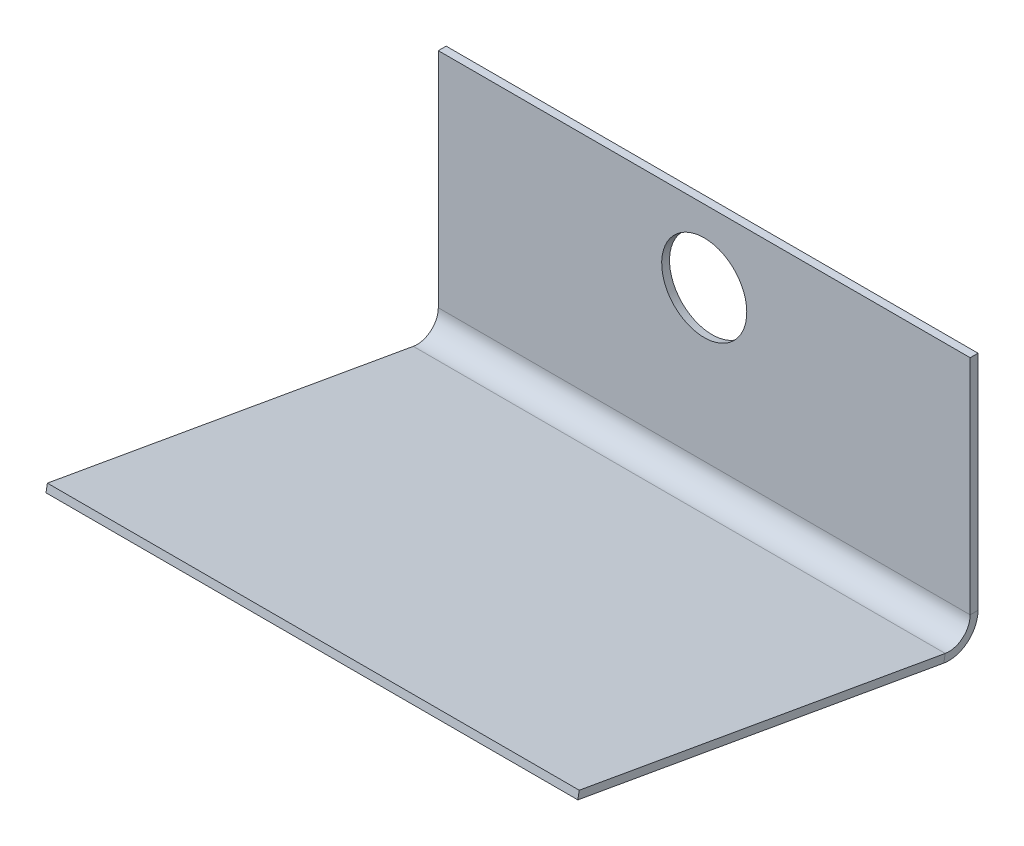
ISO-10303-21;
HEADER;
FILE_DESCRIPTION(('STEP AP214'),'2;1');
FILE_NAME('part.step','',(''),(''),'','','');
FILE_SCHEMA(('AUTOMOTIVE_DESIGN { 1 0 10303 214 1 1 1 1 }'));
ENDSEC;
DATA;
#1=APPLICATION_CONTEXT('core data for automotive mechanical design processes');
#2=APPLICATION_PROTOCOL_DEFINITION('international standard','automotive_design',2000,#1);
#3=PRODUCT_CONTEXT('',#1,'mechanical');
#4=PRODUCT('Part','Part','',(#3));
#5=PRODUCT_RELATED_PRODUCT_CATEGORY('part','',(#4));
#6=PRODUCT_DEFINITION_FORMATION('','',#4);
#7=PRODUCT_DEFINITION_CONTEXT('part definition',#1,'design');
#8=PRODUCT_DEFINITION('design','',#6,#7);
#9=PRODUCT_DEFINITION_SHAPE('','',#8);
#10=(LENGTH_UNIT() NAMED_UNIT(*) SI_UNIT(.MILLI.,.METRE.));
#11=(NAMED_UNIT(*) PLANE_ANGLE_UNIT() SI_UNIT($,.RADIAN.));
#12=(NAMED_UNIT(*) SI_UNIT($,.STERADIAN.) SOLID_ANGLE_UNIT());
#13=UNCERTAINTY_MEASURE_WITH_UNIT(LENGTH_MEASURE(1.E-05),#10,'distance_accuracy_value','');
#14=(GEOMETRIC_REPRESENTATION_CONTEXT(3) GLOBAL_UNCERTAINTY_ASSIGNED_CONTEXT((#13)) GLOBAL_UNIT_ASSIGNED_CONTEXT((#10,
#11,#12)) REPRESENTATION_CONTEXT('',''));
#15=CARTESIAN_POINT('',(0.,0.,0.));
#16=DIRECTION('',(0.,0.,1.));
#17=DIRECTION('',(1.,0.,0.));
#18=AXIS2_PLACEMENT_3D('',#15,#16,#17);
#19=CARTESIAN_POINT('',(25.,12.4378051286053,36.8777591281433));
#20=DIRECTION('',(1.,0.,0.));
#21=DIRECTION('',(0.,-0.984807753012207,0.173648177666934));
#22=AXIS2_PLACEMENT_3D('',#19,#20,#21);
#23=PLANE('',#22);
#24=DIRECTION('',(0.,-0.173648177666934,-0.984807753012207));
#25=VECTOR('',#24,1.);
#26=CARTESIAN_POINT('',(25.,12.4378051286053,36.8777591281433));
#27=LINE('',#26,#25);
#28=CARTESIAN_POINT('',(25.,12.4378051286053,36.8777591281433));
#29=VERTEX_POINT('',#28);
#30=CARTESIAN_POINT('',(25.,6.37170673685588,2.47520560300333));
#31=VERTEX_POINT('',#30);
#32=EDGE_CURVE('E107',#29,#31,#27,.T.);
#33=ORIENTED_EDGE('',*,*,#32,.T.);
#34=DIRECTION('',(0.,0.984807753012209,-0.173648177666927));
#35=VECTOR('',#34,1.);
#36=CARTESIAN_POINT('',(25.,6.37170673685612,2.47520560300329));
#37=LINE('',#36,#35);
#38=CARTESIAN_POINT('',(25.,7.09711612772467,2.34729635533387));
#39=VERTEX_POINT('',#38);
#40=EDGE_CURVE('E12',#31,#39,#37,.T.);
#41=ORIENTED_EDGE('',*,*,#40,.T.);
#42=DIRECTION('',(0.,-0.173648177666934,-0.984807753012207));
#43=VECTOR('',#42,1.);
#44=CARTESIAN_POINT('',(25.,13.1632145194741,36.7498498804739));
#45=LINE('',#44,#43);
#46=CARTESIAN_POINT('',(25.,13.1632145194741,36.7498498804739));
#47=VERTEX_POINT('',#46);
#48=EDGE_CURVE('E97',#47,#39,#45,.T.);
#49=ORIENTED_EDGE('',*,*,#48,.F.);
#50=DIRECTION('',(0.,0.984807753012207,-0.173648177666934));
#51=VECTOR('',#50,1.);
#52=CARTESIAN_POINT('',(25.,12.4378051286053,36.8777591281433));
#53=LINE('',#52,#51);
#54=EDGE_CURVE('E74',#29,#47,#53,.T.);
#55=ORIENTED_EDGE('',*,*,#54,.F.);
#56=EDGE_LOOP('',(#33,#41,#49,#55));
#57=FACE_BOUND('',#56,.T.);
#58=ADVANCED_FACE('F49',(#57),#23,.T.);
#59=CARTESIAN_POINT('',(-25.,12.4378051286053,36.8777591281433));
#60=DIRECTION('',(-1.,0.,0.));
#61=DIRECTION('',(0.,0.984807753012207,-0.173648177666934));
#62=AXIS2_PLACEMENT_3D('',#59,#60,#61);
#63=PLANE('',#62);
#64=DIRECTION('',(0.,0.173648177666934,0.984807753012207));
#65=VECTOR('',#64,1.);
#66=CARTESIAN_POINT('',(-25.,13.1632145194741,36.7498498804739));
#67=LINE('',#66,#65);
#68=CARTESIAN_POINT('',(-25.,7.09711612772467,2.34729635533387));
#69=VERTEX_POINT('',#68);
#70=CARTESIAN_POINT('',(-25.,13.1632145194741,36.7498498804739));
#71=VERTEX_POINT('',#70);
#72=EDGE_CURVE('E101',#69,#71,#67,.T.);
#73=ORIENTED_EDGE('',*,*,#72,.F.);
#74=DIRECTION('',(0.,-0.984807753012209,0.173648177666927));
#75=VECTOR('',#74,1.);
#76=CARTESIAN_POINT('',(-25.,6.37170673685612,2.47520560300329));
#77=LINE('',#76,#75);
#78=CARTESIAN_POINT('',(-25.,6.37170673685588,2.47520560300333));
#79=VERTEX_POINT('',#78);
#80=EDGE_CURVE('E118',#69,#79,#77,.T.);
#81=ORIENTED_EDGE('',*,*,#80,.T.);
#82=DIRECTION('',(0.,0.173648177666934,0.984807753012207));
#83=VECTOR('',#82,1.);
#84=CARTESIAN_POINT('',(-25.,12.4378051286053,36.8777591281433));
#85=LINE('',#84,#83);
#86=CARTESIAN_POINT('',(-25.,12.4378051286053,36.8777591281433));
#87=VERTEX_POINT('',#86);
#88=EDGE_CURVE('E109',#79,#87,#85,.T.);
#89=ORIENTED_EDGE('',*,*,#88,.T.);
#90=DIRECTION('',(0.,0.984807753012207,-0.173648177666934));
#91=VECTOR('',#90,1.);
#92=CARTESIAN_POINT('',(-25.,12.4378051286053,36.8777591281433));
#93=LINE('',#92,#91);
#94=EDGE_CURVE('E94',#87,#71,#93,.T.);
#95=ORIENTED_EDGE('',*,*,#94,.T.);
#96=EDGE_LOOP('',(#73,#81,#89,#95));
#97=FACE_BOUND('',#96,.T.);
#98=ADVANCED_FACE('F124',(#97),#63,.T.);
#99=CARTESIAN_POINT('',(0.,7.22835979859729,7.33352653777709));
#100=DIRECTION('',(0.,-0.984807753012207,0.173648177666934));
#101=DIRECTION('',(-1.,0.,0.));
#102=AXIS2_PLACEMENT_3D('',#99,#100,#101);
#103=PLANE('',#102);
#104=ORIENTED_EDGE('',*,*,#88,.F.);
#105=DIRECTION('',(1.,0.,0.));
#106=VECTOR('',#105,1.);
#107=CARTESIAN_POINT('',(0.,6.37170673685588,2.47520560300333));
#108=LINE('',#107,#106);
#109=EDGE_CURVE('E93',#79,#31,#108,.T.);
#110=ORIENTED_EDGE('',*,*,#109,.T.);
#111=ORIENTED_EDGE('',*,*,#32,.F.);
#112=DIRECTION('',(1.,0.,0.));
#113=VECTOR('',#112,1.);
#114=CARTESIAN_POINT('',(-25.,12.4378051286053,36.8777591281433));
#115=LINE('',#114,#113);
#116=EDGE_CURVE('E92',#87,#29,#115,.T.);
#117=ORIENTED_EDGE('',*,*,#116,.F.);
#118=EDGE_LOOP('',(#104,#110,#111,#117));
#119=FACE_BOUND('',#118,.T.);
#120=ADVANCED_FACE('F128',(#119),#103,.T.);
#121=CARTESIAN_POINT('',(-25.,12.4378051286053,36.8777591281433));
#122=DIRECTION('',(0.,0.173648177666934,0.984807753012207));
#123=DIRECTION('',(0.,-0.984807753012207,0.173648177666934));
#124=AXIS2_PLACEMENT_3D('',#121,#122,#123);
#125=PLANE('',#124);
#126=DIRECTION('',(1.,0.,0.));
#127=VECTOR('',#126,1.);
#128=CARTESIAN_POINT('',(-25.,13.1632145194741,36.7498498804739));
#129=LINE('',#128,#127);
#130=EDGE_CURVE('E90',#71,#47,#129,.T.);
#131=ORIENTED_EDGE('',*,*,#130,.F.);
#132=ORIENTED_EDGE('',*,*,#94,.F.);
#133=ORIENTED_EDGE('',*,*,#116,.T.);
#134=ORIENTED_EDGE('',*,*,#54,.T.);
#135=EDGE_LOOP('',(#131,#132,#133,#134));
#136=FACE_BOUND('',#135,.T.);
#137=ADVANCED_FACE('F87',(#136),#125,.T.);
#138=CARTESIAN_POINT('',(0.,7.95376918946608,7.20561729010763));
#139=DIRECTION('',(0.,-0.984807753012207,0.173648177666934));
#140=DIRECTION('',(-1.,0.,0.));
#141=AXIS2_PLACEMENT_3D('',#138,#139,#140);
#142=PLANE('',#141);
#143=DIRECTION('',(1.,0.,0.));
#144=VECTOR('',#143,1.);
#145=CARTESIAN_POINT('',(0.,7.09711612772468,2.34729635533387));
#146=LINE('',#145,#144);
#147=EDGE_CURVE('E57',#69,#39,#146,.T.);
#148=ORIENTED_EDGE('',*,*,#147,.F.);
#149=ORIENTED_EDGE('',*,*,#72,.T.);
#150=ORIENTED_EDGE('',*,*,#130,.T.);
#151=ORIENTED_EDGE('',*,*,#48,.T.);
#152=EDGE_LOOP('',(#148,#149,#150,#151));
#153=FACE_BOUND('',#152,.T.);
#154=ADVANCED_FACE('F104',(#153),#142,.F.);
#155=CARTESIAN_POINT('',(-25.,30.,-0.7366));
#156=DIRECTION('',(0.,1.,0.));
#157=DIRECTION('',(0.,0.,1.));
#158=AXIS2_PLACEMENT_3D('',#155,#156,#157);
#159=PLANE('',#158);
#160=DIRECTION('',(-1.,0.,0.));
#161=VECTOR('',#160,1.);
#162=CARTESIAN_POINT('',(-25.,30.,0.));
#163=LINE('',#162,#161);
#164=CARTESIAN_POINT('',(25.,30.,0.));
#165=VERTEX_POINT('',#164);
#166=CARTESIAN_POINT('',(-25.,30.,0.));
#167=VERTEX_POINT('',#166);
#168=EDGE_CURVE('E159',#165,#167,#163,.T.);
#169=ORIENTED_EDGE('',*,*,#168,.F.);
#170=DIRECTION('',(0.,0.,1.));
#171=VECTOR('',#170,1.);
#172=CARTESIAN_POINT('',(25.,30.,-0.7366));
#173=LINE('',#172,#171);
#174=CARTESIAN_POINT('',(25.,30.,-0.7366));
#175=VERTEX_POINT('',#174);
#176=EDGE_CURVE('E102',#175,#165,#173,.T.);
#177=ORIENTED_EDGE('',*,*,#176,.F.);
#178=DIRECTION('',(-1.,0.,0.));
#179=VECTOR('',#178,1.);
#180=CARTESIAN_POINT('',(-25.,30.,-0.7366));
#181=LINE('',#180,#179);
#182=CARTESIAN_POINT('',(-25.,30.,-0.7366));
#183=VERTEX_POINT('',#182);
#184=EDGE_CURVE('E177',#175,#183,#181,.T.);
#185=ORIENTED_EDGE('',*,*,#184,.T.);
#186=DIRECTION('',(0.,0.,1.));
#187=VECTOR('',#186,1.);
#188=CARTESIAN_POINT('',(-25.,30.,-0.7366));
#189=LINE('',#188,#187);
#190=EDGE_CURVE('E174',#183,#167,#189,.T.);
#191=ORIENTED_EDGE('',*,*,#190,.T.);
#192=EDGE_LOOP('',(#169,#177,#185,#191));
#193=FACE_BOUND('',#192,.T.);
#194=ADVANCED_FACE('F220',(#193),#159,.T.);
#195=CARTESIAN_POINT('',(0.,0.,-0.7366));
#196=DIRECTION('',(0.,0.,-1.));
#197=DIRECTION('',(-1.,0.,0.));
#198=AXIS2_PLACEMENT_3D('',#195,#196,#197);
#199=PLANE('',#198);
#200=CARTESIAN_POINT('',(0.,23.0676311543134,-0.7366));
#201=DIRECTION('',(0.,0.,-1.));
#202=DIRECTION('',(0.,1.,0.));
#203=AXIS2_PLACEMENT_3D('',#200,#201,#202);
#204=ELLIPSE('',#203,4.06170644754298,4.);
#205=CARTESIAN_POINT('',(0.,27.1293376018564,-0.7366));
#206=VERTEX_POINT('',#205);
#207=EDGE_CURVE('E151',#206,#206,#204,.T.);
#208=ORIENTED_EDGE('',*,*,#207,.F.);
#209=EDGE_LOOP('',(#208));
#210=FACE_BOUND('',#209,.T.);
#211=DIRECTION('',(1.,0.,0.));
#212=VECTOR('',#211,1.);
#213=CARTESIAN_POINT('',(0.,9.06673163374909,-0.7366));
#214=LINE('',#213,#212);
#215=CARTESIAN_POINT('',(-25.,9.06673163374909,-0.7366));
#216=VERTEX_POINT('',#215);
#217=CARTESIAN_POINT('',(25.,9.06673163374909,-0.7366));
#218=VERTEX_POINT('',#217);
#219=EDGE_CURVE('E145',#216,#218,#214,.T.);
#220=ORIENTED_EDGE('',*,*,#219,.F.);
#221=DIRECTION('',(0.,-1.,0.));
#222=VECTOR('',#221,1.);
#223=CARTESIAN_POINT('',(-25.,-30.,-0.7366));
#224=LINE('',#223,#222);
#225=EDGE_CURVE('E171',#183,#216,#224,.T.);
#226=ORIENTED_EDGE('',*,*,#225,.F.);
#227=ORIENTED_EDGE('',*,*,#184,.F.);
#228=DIRECTION('',(0.,1.,0.));
#229=VECTOR('',#228,1.);
#230=CARTESIAN_POINT('',(25.,-30.,-0.7366));
#231=LINE('',#230,#229);
#232=EDGE_CURVE('E156',#218,#175,#231,.T.);
#233=ORIENTED_EDGE('',*,*,#232,.F.);
#234=EDGE_LOOP('',(#220,#226,#227,#233));
#235=FACE_BOUND('',#234,.T.);
#236=ADVANCED_FACE('F216',(#210,#235),#199,.T.);
#237=CARTESIAN_POINT('',(-25.,-30.,-0.7366));
#238=DIRECTION('',(-1.,0.,0.));
#239=DIRECTION('',(0.,0.,1.));
#240=AXIS2_PLACEMENT_3D('',#237,#238,#239);
#241=PLANE('',#240);
#242=DIRECTION('',(0.,0.,-1.));
#243=VECTOR('',#242,1.);
#244=CARTESIAN_POINT('',(-25.,9.06673163374909,-0.736599999999727));
#245=LINE('',#244,#243);
#246=CARTESIAN_POINT('',(-25.,9.06673163374908,0.));
#247=VERTEX_POINT('',#246);
#248=EDGE_CURVE('E142',#247,#216,#245,.T.);
#249=ORIENTED_EDGE('',*,*,#248,.F.);
#250=DIRECTION('',(0.,-1.,0.));
#251=VECTOR('',#250,1.);
#252=CARTESIAN_POINT('',(-25.,-30.,0.));
#253=LINE('',#252,#251);
#254=EDGE_CURVE('E168',#167,#247,#253,.T.);
#255=ORIENTED_EDGE('',*,*,#254,.F.);
#256=ORIENTED_EDGE('',*,*,#190,.F.);
#257=ORIENTED_EDGE('',*,*,#225,.T.);
#258=EDGE_LOOP('',(#249,#255,#256,#257));
#259=FACE_BOUND('',#258,.T.);
#260=ADVANCED_FACE('F213',(#259),#241,.T.);
#261=CARTESIAN_POINT('',(0.,0.,0.));
#262=DIRECTION('',(0.,0.,-1.));
#263=DIRECTION('',(-1.,0.,0.));
#264=AXIS2_PLACEMENT_3D('',#261,#262,#263);
#265=PLANE('',#264);
#266=CARTESIAN_POINT('',(0.,23.1975136083033,0.));
#267=DIRECTION('',(0.,0.,-1.));
#268=DIRECTION('',(0.,1.,0.));
#269=AXIS2_PLACEMENT_3D('',#266,#267,#268);
#270=ELLIPSE('',#269,4.06170644754298,4.);
#271=CARTESIAN_POINT('',(0.,27.2592200558463,0.));
#272=VERTEX_POINT('',#271);
#273=EDGE_CURVE('E52',#272,#272,#270,.T.);
#274=ORIENTED_EDGE('',*,*,#273,.T.);
#275=EDGE_LOOP('',(#274));
#276=FACE_BOUND('',#275,.T.);
#277=ORIENTED_EDGE('',*,*,#254,.T.);
#278=DIRECTION('',(1.,0.,0.));
#279=VECTOR('',#278,1.);
#280=CARTESIAN_POINT('',(0.,9.06673163374908,0.));
#281=LINE('',#280,#279);
#282=CARTESIAN_POINT('',(25.,9.06673163374908,0.));
#283=VERTEX_POINT('',#282);
#284=EDGE_CURVE('E165',#247,#283,#281,.T.);
#285=ORIENTED_EDGE('',*,*,#284,.T.);
#286=DIRECTION('',(0.,1.,0.));
#287=VECTOR('',#286,1.);
#288=CARTESIAN_POINT('',(25.,-30.,0.));
#289=LINE('',#288,#287);
#290=EDGE_CURVE('E162',#283,#165,#289,.T.);
#291=ORIENTED_EDGE('',*,*,#290,.T.);
#292=ORIENTED_EDGE('',*,*,#168,.T.);
#293=EDGE_LOOP('',(#277,#285,#291,#292));
#294=FACE_BOUND('',#293,.T.);
#295=ADVANCED_FACE('F223',(#276,#294),#265,.F.);
#296=CARTESIAN_POINT('',(25.,-30.,-0.7366));
#297=DIRECTION('',(1.,0.,0.));
#298=DIRECTION('',(0.,0.,-1.));
#299=AXIS2_PLACEMENT_3D('',#296,#297,#298);
#300=PLANE('',#299);
#301=DIRECTION('',(0.,0.,1.));
#302=VECTOR('',#301,1.);
#303=CARTESIAN_POINT('',(25.,9.06673163374909,-0.736599999999727));
#304=LINE('',#303,#302);
#305=EDGE_CURVE('E181',#218,#283,#304,.T.);
#306=ORIENTED_EDGE('',*,*,#305,.F.);
#307=ORIENTED_EDGE('',*,*,#232,.T.);
#308=ORIENTED_EDGE('',*,*,#176,.T.);
#309=ORIENTED_EDGE('',*,*,#290,.F.);
#310=EDGE_LOOP('',(#306,#307,#308,#309));
#311=FACE_BOUND('',#310,.T.);
#312=ADVANCED_FACE('F221',(#311),#300,.T.);
#313=CARTESIAN_POINT('',(-25.,9.06673163374909,2.));
#314=DIRECTION('',(-1.,0.,0.));
#315=DIRECTION('',(0.,0.,1.));
#316=AXIS2_PLACEMENT_3D('',#313,#314,#315);
#317=PLANE('',#316);
#318=ORIENTED_EDGE('',*,*,#80,.F.);
#319=CARTESIAN_POINT('',(-25.,9.06673163374909,2.));
#320=DIRECTION('',(-1.,0.,0.));
#321=DIRECTION('',(0.,0.,1.));
#322=AXIS2_PLACEMENT_3D('',#319,#320,#321);
#323=CIRCLE('',#322,2.);
#324=EDGE_CURVE('E148',#69,#247,#323,.F.);
#325=ORIENTED_EDGE('',*,*,#324,.T.);
#326=ORIENTED_EDGE('',*,*,#248,.T.);
#327=CARTESIAN_POINT('',(-25.,9.06673163374909,2.));
#328=DIRECTION('',(1.,0.,0.));
#329=DIRECTION('',(0.,0.,1.));
#330=AXIS2_PLACEMENT_3D('',#327,#328,#329);
#331=CIRCLE('',#330,2.7366);
#332=EDGE_CURVE('E133',#79,#216,#331,.T.);
#333=ORIENTED_EDGE('',*,*,#332,.F.);
#334=EDGE_LOOP('',(#318,#325,#326,#333));
#335=FACE_BOUND('',#334,.T.);
#336=ADVANCED_FACE('F138',(#335),#317,.T.);
#337=CARTESIAN_POINT('',(25.,9.06673163374909,2.));
#338=DIRECTION('',(1.,0.,0.));
#339=DIRECTION('',(0.,0.,-1.));
#340=AXIS2_PLACEMENT_3D('',#337,#338,#339);
#341=PLANE('',#340);
#342=CARTESIAN_POINT('',(25.,9.06673163374909,2.));
#343=DIRECTION('',(-1.,0.,0.));
#344=DIRECTION('',(0.,0.,1.));
#345=AXIS2_PLACEMENT_3D('',#342,#343,#344);
#346=CIRCLE('',#345,2.);
#347=EDGE_CURVE('E143',#283,#39,#346,.T.);
#348=ORIENTED_EDGE('',*,*,#347,.T.);
#349=ORIENTED_EDGE('',*,*,#40,.F.);
#350=CARTESIAN_POINT('',(25.,9.06673163374909,2.));
#351=DIRECTION('',(-1.,0.,0.));
#352=DIRECTION('',(0.,0.,-1.));
#353=AXIS2_PLACEMENT_3D('',#350,#351,#352);
#354=CIRCLE('',#353,2.7366);
#355=EDGE_CURVE('E65',#218,#31,#354,.T.);
#356=ORIENTED_EDGE('',*,*,#355,.F.);
#357=ORIENTED_EDGE('',*,*,#305,.T.);
#358=EDGE_LOOP('',(#348,#349,#356,#357));
#359=FACE_BOUND('',#358,.T.);
#360=ADVANCED_FACE('F190',(#359),#341,.T.);
#361=CARTESIAN_POINT('',(50.1759713223746,9.06673163374909,2.));
#362=DIRECTION('',(-1.,0.,0.));
#363=DIRECTION('',(0.,0.,1.));
#364=AXIS2_PLACEMENT_3D('',#361,#362,#363);
#365=CYLINDRICAL_SURFACE('',#364,2.7366);
#366=ORIENTED_EDGE('',*,*,#219,.T.);
#367=ORIENTED_EDGE('',*,*,#355,.T.);
#368=ORIENTED_EDGE('',*,*,#109,.F.);
#369=ORIENTED_EDGE('',*,*,#332,.T.);
#370=EDGE_LOOP('',(#366,#367,#368,#369));
#371=FACE_BOUND('',#370,.T.);
#372=ADVANCED_FACE('F131',(#371),#365,.T.);
#373=CARTESIAN_POINT('',(50.1759713223746,9.06673163374909,2.));
#374=DIRECTION('',(-1.,0.,0.));
#375=DIRECTION('',(0.,0.,1.));
#376=AXIS2_PLACEMENT_3D('',#373,#374,#375);
#377=CYLINDRICAL_SURFACE('',#376,2.);
#378=ORIENTED_EDGE('',*,*,#284,.F.);
#379=ORIENTED_EDGE('',*,*,#324,.F.);
#380=ORIENTED_EDGE('',*,*,#147,.T.);
#381=ORIENTED_EDGE('',*,*,#347,.F.);
#382=EDGE_LOOP('',(#378,#379,#380,#381));
#383=FACE_BOUND('',#382,.T.);
#384=ADVANCED_FACE('F196',(#383),#377,.F.);
#385=CARTESIAN_POINT('',(0.,22.5629337889723,-3.59888099246837));
#386=DIRECTION('',(0.,0.173648177666931,0.984807753012208));
#387=DIRECTION('',(0.,-0.984807753012208,0.173648177666931));
#388=AXIS2_PLACEMENT_3D('',#385,#386,#387);
#389=CYLINDRICAL_SURFACE('',#388,4.);
#390=ORIENTED_EDGE('',*,*,#207,.T.);
#391=EDGE_LOOP('',(#390));
#392=FACE_BOUND('',#391,.T.);
#393=ORIENTED_EDGE('',*,*,#273,.F.);
#394=EDGE_LOOP('',(#393));
#395=FACE_BOUND('',#394,.T.);
#396=ADVANCED_FACE('F374',(#392,#395),#389,.F.);
#397=CLOSED_SHELL('',(#58,#98,#120,#137,#154,#194,#236,#260,#295,#312,#336,#360,#372,#384,#396));
#398=MANIFOLD_SOLID_BREP('B2',#397);
#399=ADVANCED_BREP_SHAPE_REPRESENTATION('',(#18,#398),#14);
#400=SHAPE_DEFINITION_REPRESENTATION(#9,#399);
ENDSEC;
END-ISO-10303-21;
